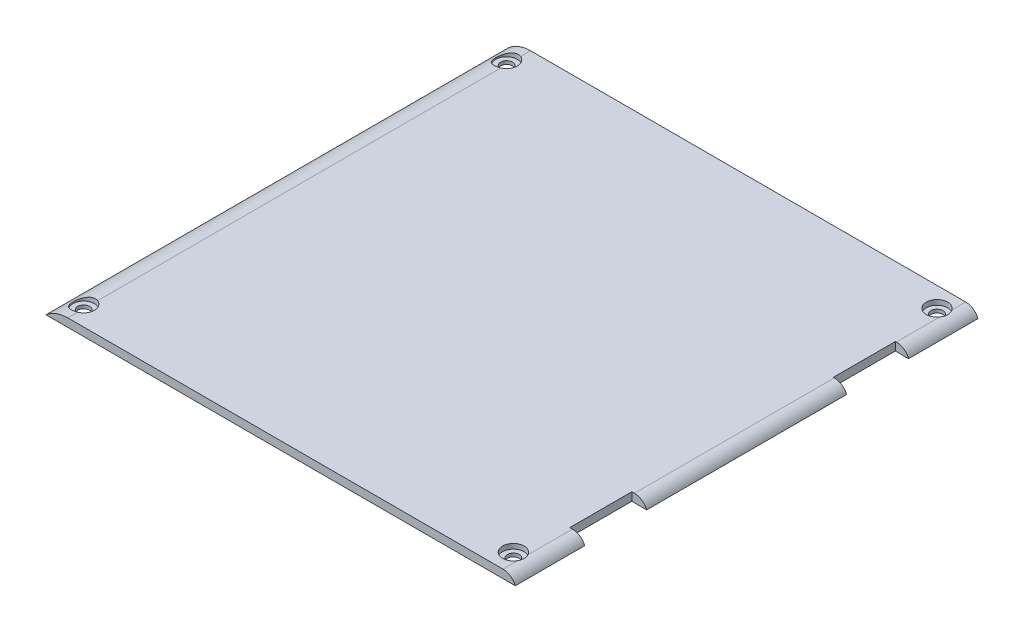
ISO-10303-21;
HEADER;
FILE_DESCRIPTION(('STEP AP214'),'2;1');
FILE_NAME('part.step','',(''),(''),'','','');
FILE_SCHEMA(('AUTOMOTIVE_DESIGN { 1 0 10303 214 1 1 1 1 }'));
ENDSEC;
DATA;
#1=APPLICATION_CONTEXT('core data for automotive mechanical design processes');
#2=APPLICATION_PROTOCOL_DEFINITION('international standard','automotive_design',2000,#1);
#3=PRODUCT_CONTEXT('',#1,'mechanical');
#4=PRODUCT('Part','Part','',(#3));
#5=PRODUCT_RELATED_PRODUCT_CATEGORY('part','',(#4));
#6=PRODUCT_DEFINITION_FORMATION('','',#4);
#7=PRODUCT_DEFINITION_CONTEXT('part definition',#1,'design');
#8=PRODUCT_DEFINITION('design','',#6,#7);
#9=PRODUCT_DEFINITION_SHAPE('','',#8);
#10=(LENGTH_UNIT() NAMED_UNIT(*) SI_UNIT(.MILLI.,.METRE.));
#11=(NAMED_UNIT(*) PLANE_ANGLE_UNIT() SI_UNIT($,.RADIAN.));
#12=(NAMED_UNIT(*) SI_UNIT($,.STERADIAN.) SOLID_ANGLE_UNIT());
#13=UNCERTAINTY_MEASURE_WITH_UNIT(LENGTH_MEASURE(1.E-05),#10,'distance_accuracy_value','');
#14=(GEOMETRIC_REPRESENTATION_CONTEXT(3) GLOBAL_UNCERTAINTY_ASSIGNED_CONTEXT((#13)) GLOBAL_UNIT_ASSIGNED_CONTEXT((#10,
#11,#12)) REPRESENTATION_CONTEXT('',''));
#15=CARTESIAN_POINT('',(0.,0.,0.));
#16=DIRECTION('',(0.,0.,1.));
#17=DIRECTION('',(1.,0.,0.));
#18=AXIS2_PLACEMENT_3D('',#15,#16,#17);
#19=CARTESIAN_POINT('',(-71.,-2.5,70.));
#20=DIRECTION('',(0.,0.,1.));
#21=DIRECTION('',(1.,0.,0.));
#22=AXIS2_PLACEMENT_3D('',#19,#20,#21);
#23=PLANE('',#22);
#24=DIRECTION('',(1.,0.,0.));
#25=VECTOR('',#24,1.);
#26=CARTESIAN_POINT('',(-71.,-2.5,70.));
#27=LINE('',#26,#25);
#28=CARTESIAN_POINT('',(-71.,-2.5,70.));
#29=VERTEX_POINT('',#28);
#30=CARTESIAN_POINT('',(71.,-2.5,70.));
#31=VERTEX_POINT('',#30);
#32=EDGE_CURVE('E240',#29,#31,#27,.T.);
#33=ORIENTED_EDGE('',*,*,#32,.T.);
#34=CARTESIAN_POINT('',(67.2919007564522,-4.,70.));
#35=DIRECTION('',(0.,0.,1.));
#36=DIRECTION('',(1.,0.,0.));
#37=AXIS2_PLACEMENT_3D('',#34,#35,#36);
#38=CIRCLE('',#37,4.);
#39=CARTESIAN_POINT('',(67.2919007564522,0.,70.));
#40=VERTEX_POINT('',#39);
#41=EDGE_CURVE('E338',#31,#40,#38,.T.);
#42=ORIENTED_EDGE('',*,*,#41,.T.);
#43=DIRECTION('',(1.,0.,0.));
#44=VECTOR('',#43,1.);
#45=CARTESIAN_POINT('',(-71.,0.,70.));
#46=LINE('',#45,#44);
#47=CARTESIAN_POINT('',(-64.3856217223385,0.,70.));
#48=VERTEX_POINT('',#47);
#49=EDGE_CURVE('E247',#48,#40,#46,.T.);
#50=ORIENTED_EDGE('',*,*,#49,.F.);
#51=CARTESIAN_POINT('',(-64.3856217223385,-10.,70.));
#52=DIRECTION('',(0.,0.,1.));
#53=DIRECTION('',(1.,0.,0.));
#54=AXIS2_PLACEMENT_3D('',#51,#52,#53);
#55=CIRCLE('',#54,10.);
#56=EDGE_CURVE('E614',#48,#29,#55,.T.);
#57=ORIENTED_EDGE('',*,*,#56,.T.);
#58=EDGE_LOOP('',(#33,#42,#50,#57));
#59=FACE_BOUND('',#58,.T.);
#60=ADVANCED_FACE('F36',(#59),#23,.T.);
#61=CARTESIAN_POINT('',(-71.,-2.5,-70.));
#62=DIRECTION('',(0.,0.,-1.));
#63=DIRECTION('',(-1.,0.,0.));
#64=AXIS2_PLACEMENT_3D('',#61,#62,#63);
#65=PLANE('',#64);
#66=DIRECTION('',(-1.,0.,0.));
#67=VECTOR('',#66,1.);
#68=CARTESIAN_POINT('',(-71.,0.,-70.));
#69=LINE('',#68,#67);
#70=CARTESIAN_POINT('',(67.2919007564522,0.,-70.));
#71=VERTEX_POINT('',#70);
#72=CARTESIAN_POINT('',(-64.3856217223385,0.,-70.));
#73=VERTEX_POINT('',#72);
#74=EDGE_CURVE('E223',#71,#73,#69,.T.);
#75=ORIENTED_EDGE('',*,*,#74,.F.);
#76=CARTESIAN_POINT('',(67.2919007564522,-4.,-70.));
#77=DIRECTION('',(0.,0.,-1.));
#78=DIRECTION('',(-1.,0.,0.));
#79=AXIS2_PLACEMENT_3D('',#76,#77,#78);
#80=CIRCLE('',#79,4.);
#81=CARTESIAN_POINT('',(71.,-2.5,-70.));
#82=VERTEX_POINT('',#81);
#83=EDGE_CURVE('E46',#71,#82,#80,.T.);
#84=ORIENTED_EDGE('',*,*,#83,.T.);
#85=DIRECTION('',(-1.,0.,0.));
#86=VECTOR('',#85,1.);
#87=CARTESIAN_POINT('',(-71.,-2.5,-70.));
#88=LINE('',#87,#86);
#89=CARTESIAN_POINT('',(-71.,-2.5,-70.));
#90=VERTEX_POINT('',#89);
#91=EDGE_CURVE('E231',#82,#90,#88,.T.);
#92=ORIENTED_EDGE('',*,*,#91,.T.);
#93=CARTESIAN_POINT('',(-64.3856217223385,-10.,-70.));
#94=DIRECTION('',(0.,0.,-1.));
#95=DIRECTION('',(-1.,0.,0.));
#96=AXIS2_PLACEMENT_3D('',#93,#94,#95);
#97=CIRCLE('',#96,10.);
#98=EDGE_CURVE('E616',#90,#73,#97,.T.);
#99=ORIENTED_EDGE('',*,*,#98,.T.);
#100=EDGE_LOOP('',(#75,#84,#92,#99));
#101=FACE_BOUND('',#100,.T.);
#102=ADVANCED_FACE('F317',(#101),#65,.T.);
#103=CARTESIAN_POINT('',(0.,-2.5,0.));
#104=DIRECTION('',(0.,1.,0.));
#105=DIRECTION('',(0.,0.,1.));
#106=AXIS2_PLACEMENT_3D('',#103,#104,#105);
#107=PLANE('',#106);
#108=CARTESIAN_POINT('',(-65.6357603,-2.5,-64.));
#109=DIRECTION('',(0.,1.,0.));
#110=DIRECTION('',(0.,0.,1.));
#111=AXIS2_PLACEMENT_3D('',#108,#109,#110);
#112=CIRCLE('',#111,1.8);
#113=CARTESIAN_POINT('',(-65.6357603,-2.5,-62.2));
#114=VERTEX_POINT('',#113);
#115=EDGE_CURVE('E637',#114,#114,#112,.T.);
#116=ORIENTED_EDGE('',*,*,#115,.T.);
#117=EDGE_LOOP('',(#116));
#118=FACE_BOUND('',#117,.T.);
#119=CARTESIAN_POINT('',(64.59576602,-2.5,-64.));
#120=DIRECTION('',(0.,1.,0.));
#121=DIRECTION('',(0.,0.,1.));
#122=AXIS2_PLACEMENT_3D('',#119,#120,#121);
#123=CIRCLE('',#122,1.8);
#124=CARTESIAN_POINT('',(64.59576602,-2.5,-62.2));
#125=VERTEX_POINT('',#124);
#126=EDGE_CURVE('E656',#125,#125,#123,.T.);
#127=ORIENTED_EDGE('',*,*,#126,.T.);
#128=EDGE_LOOP('',(#127));
#129=FACE_BOUND('',#128,.T.);
#130=CARTESIAN_POINT('',(64.41475083,-2.5,64.));
#131=DIRECTION('',(0.,1.,0.));
#132=DIRECTION('',(0.,0.,1.));
#133=AXIS2_PLACEMENT_3D('',#130,#131,#132);
#134=CIRCLE('',#133,1.8);
#135=CARTESIAN_POINT('',(64.41475083,-2.5,65.8));
#136=VERTEX_POINT('',#135);
#137=EDGE_CURVE('E669',#136,#136,#134,.T.);
#138=ORIENTED_EDGE('',*,*,#137,.T.);
#139=EDGE_LOOP('',(#138));
#140=FACE_BOUND('',#139,.T.);
#141=CARTESIAN_POINT('',(-65.595766,-2.5,64.));
#142=DIRECTION('',(0.,1.,0.));
#143=DIRECTION('',(0.,0.,1.));
#144=AXIS2_PLACEMENT_3D('',#141,#142,#143);
#145=CIRCLE('',#144,1.8);
#146=CARTESIAN_POINT('',(-65.595766,-2.5,65.8));
#147=VERTEX_POINT('',#146);
#148=EDGE_CURVE('E186',#147,#147,#145,.T.);
#149=ORIENTED_EDGE('',*,*,#148,.T.);
#150=EDGE_LOOP('',(#149));
#151=FACE_BOUND('',#150,.T.);
#152=DIRECTION('',(0.,0.,-1.));
#153=VECTOR('',#152,1.);
#154=CARTESIAN_POINT('',(71.,-2.5,-70.));
#155=LINE('',#154,#153);
#156=CARTESIAN_POINT('',(71.,-2.5,30.25));
#157=VERTEX_POINT('',#156);
#158=CARTESIAN_POINT('',(71.,-2.5,-30.25));
#159=VERTEX_POINT('',#158);
#160=EDGE_CURVE('E176',#157,#159,#155,.T.);
#161=ORIENTED_EDGE('',*,*,#160,.F.);
#162=DIRECTION('',(-1.,0.,0.));
#163=VECTOR('',#162,1.);
#164=CARTESIAN_POINT('',(71.,-2.5,30.25));
#165=LINE('',#164,#163);
#166=CARTESIAN_POINT('',(66.5,-2.5,30.25));
#167=VERTEX_POINT('',#166);
#168=EDGE_CURVE('E153',#157,#167,#165,.T.);
#169=ORIENTED_EDGE('',*,*,#168,.T.);
#170=DIRECTION('',(0.,0.,1.));
#171=VECTOR('',#170,1.);
#172=CARTESIAN_POINT('',(66.5,-2.5,30.25));
#173=LINE('',#172,#171);
#174=CARTESIAN_POINT('',(66.5,-2.5,49.));
#175=VERTEX_POINT('',#174);
#176=EDGE_CURVE('E166',#167,#175,#173,.T.);
#177=ORIENTED_EDGE('',*,*,#176,.T.);
#178=DIRECTION('',(-1.,0.,0.));
#179=VECTOR('',#178,1.);
#180=CARTESIAN_POINT('',(71.,-2.5,49.));
#181=LINE('',#180,#179);
#182=CARTESIAN_POINT('',(71.,-2.5,49.));
#183=VERTEX_POINT('',#182);
#184=EDGE_CURVE('E162',#183,#175,#181,.T.);
#185=ORIENTED_EDGE('',*,*,#184,.F.);
#186=EDGE_CURVE('E227',#31,#183,#155,.T.);
#187=ORIENTED_EDGE('',*,*,#186,.F.);
#188=ORIENTED_EDGE('',*,*,#32,.F.);
#189=DIRECTION('',(0.,0.,1.));
#190=VECTOR('',#189,1.);
#191=CARTESIAN_POINT('',(-71.,-2.5,-70.));
#192=LINE('',#191,#190);
#193=EDGE_CURVE('E236',#90,#29,#192,.T.);
#194=ORIENTED_EDGE('',*,*,#193,.F.);
#195=ORIENTED_EDGE('',*,*,#91,.F.);
#196=CARTESIAN_POINT('',(71.,-2.5,-49.));
#197=VERTEX_POINT('',#196);
#198=EDGE_CURVE('E232',#197,#82,#155,.T.);
#199=ORIENTED_EDGE('',*,*,#198,.F.);
#200=DIRECTION('',(-1.,0.,0.));
#201=VECTOR('',#200,1.);
#202=CARTESIAN_POINT('',(67.,-2.5,-49.));
#203=LINE('',#202,#201);
#204=CARTESIAN_POINT('',(67.,-2.5,-49.));
#205=VERTEX_POINT('',#204);
#206=EDGE_CURVE('E206',#197,#205,#203,.T.);
#207=ORIENTED_EDGE('',*,*,#206,.T.);
#208=DIRECTION('',(0.,0.,1.));
#209=VECTOR('',#208,1.);
#210=CARTESIAN_POINT('',(67.,-2.5,-49.));
#211=LINE('',#210,#209);
#212=CARTESIAN_POINT('',(67.,-2.5,-30.25));
#213=VERTEX_POINT('',#212);
#214=EDGE_CURVE('E198',#205,#213,#211,.T.);
#215=ORIENTED_EDGE('',*,*,#214,.T.);
#216=DIRECTION('',(1.,0.,0.));
#217=VECTOR('',#216,1.);
#218=CARTESIAN_POINT('',(67.,-2.5,-30.25));
#219=LINE('',#218,#217);
#220=EDGE_CURVE('E202',#213,#159,#219,.T.);
#221=ORIENTED_EDGE('',*,*,#220,.T.);
#222=EDGE_LOOP('',(#161,#169,#177,#185,#187,#188,#194,#195,#199,#207,#215,#221));
#223=FACE_BOUND('',#222,.T.);
#224=ADVANCED_FACE('F173',(#118,#129,#140,#151,#223),#107,.F.);
#225=CARTESIAN_POINT('',(0.,0.,0.));
#226=DIRECTION('',(0.,1.,0.));
#227=DIRECTION('',(0.,0.,1.));
#228=AXIS2_PLACEMENT_3D('',#225,#226,#227);
#229=PLANE('',#228);
#230=ORIENTED_EDGE('',*,*,#49,.T.);
#231=DIRECTION('',(0.,0.,-1.));
#232=VECTOR('',#231,1.);
#233=CARTESIAN_POINT('',(67.2919007564522,0.,49.));
#234=LINE('',#233,#232);
#235=CARTESIAN_POINT('',(67.2919007564522,0.,65.5114589973652));
#236=VERTEX_POINT('',#235);
#237=EDGE_CURVE('E354',#40,#236,#234,.T.);
#238=ORIENTED_EDGE('',*,*,#237,.T.);
#239=CARTESIAN_POINT('',(64.41475083,0.,64.));
#240=DIRECTION('',(0.,1.,0.));
#241=DIRECTION('',(0.,0.,1.));
#242=AXIS2_PLACEMENT_3D('',#239,#240,#241);
#243=CIRCLE('',#242,3.25);
#244=CARTESIAN_POINT('',(67.2919007564522,0.,62.4885410026348));
#245=VERTEX_POINT('',#244);
#246=EDGE_CURVE('E660',#245,#236,#243,.T.);
#247=ORIENTED_EDGE('',*,*,#246,.F.);
#248=DIRECTION('',(0.,0.,-1.));
#249=VECTOR('',#248,1.);
#250=CARTESIAN_POINT('',(67.2919007564522,0.,49.));
#251=LINE('',#250,#249);
#252=CARTESIAN_POINT('',(67.2919007564522,0.,49.));
#253=VERTEX_POINT('',#252);
#254=EDGE_CURVE('E629',#245,#253,#251,.T.);
#255=ORIENTED_EDGE('',*,*,#254,.T.);
#256=DIRECTION('',(-1.,0.,0.));
#257=VECTOR('',#256,1.);
#258=CARTESIAN_POINT('',(71.,0.,49.));
#259=LINE('',#258,#257);
#260=CARTESIAN_POINT('',(66.5,0.,49.));
#261=VERTEX_POINT('',#260);
#262=EDGE_CURVE('E179',#253,#261,#259,.T.);
#263=ORIENTED_EDGE('',*,*,#262,.T.);
#264=DIRECTION('',(0.,0.,1.));
#265=VECTOR('',#264,1.);
#266=CARTESIAN_POINT('',(66.5,0.,30.25));
#267=LINE('',#266,#265);
#268=CARTESIAN_POINT('',(66.5,0.,30.25));
#269=VERTEX_POINT('',#268);
#270=EDGE_CURVE('E183',#269,#261,#267,.T.);
#271=ORIENTED_EDGE('',*,*,#270,.F.);
#272=DIRECTION('',(-1.,0.,0.));
#273=VECTOR('',#272,1.);
#274=CARTESIAN_POINT('',(71.,0.,30.25));
#275=LINE('',#274,#273);
#276=CARTESIAN_POINT('',(67.2919007564522,0.,30.25));
#277=VERTEX_POINT('',#276);
#278=EDGE_CURVE('E156',#277,#269,#275,.T.);
#279=ORIENTED_EDGE('',*,*,#278,.F.);
#280=DIRECTION('',(0.,0.,-1.));
#281=VECTOR('',#280,1.);
#282=CARTESIAN_POINT('',(67.2919007564522,0.,-30.25));
#283=LINE('',#282,#281);
#284=CARTESIAN_POINT('',(67.2919007564522,0.,-30.25));
#285=VERTEX_POINT('',#284);
#286=EDGE_CURVE('E335',#277,#285,#283,.T.);
#287=ORIENTED_EDGE('',*,*,#286,.T.);
#288=DIRECTION('',(1.,0.,0.));
#289=VECTOR('',#288,1.);
#290=CARTESIAN_POINT('',(67.,0.,-30.25));
#291=LINE('',#290,#289);
#292=CARTESIAN_POINT('',(67.,0.,-30.25));
#293=VERTEX_POINT('',#292);
#294=EDGE_CURVE('E213',#293,#285,#291,.T.);
#295=ORIENTED_EDGE('',*,*,#294,.F.);
#296=DIRECTION('',(0.,0.,1.));
#297=VECTOR('',#296,1.);
#298=CARTESIAN_POINT('',(67.,0.,-49.));
#299=LINE('',#298,#297);
#300=CARTESIAN_POINT('',(67.,0.,-49.));
#301=VERTEX_POINT('',#300);
#302=EDGE_CURVE('E196',#301,#293,#299,.T.);
#303=ORIENTED_EDGE('',*,*,#302,.F.);
#304=DIRECTION('',(-1.,0.,0.));
#305=VECTOR('',#304,1.);
#306=CARTESIAN_POINT('',(67.,0.,-49.));
#307=LINE('',#306,#305);
#308=CARTESIAN_POINT('',(67.2919007564522,0.,-49.));
#309=VERTEX_POINT('',#308);
#310=EDGE_CURVE('E203',#309,#301,#307,.T.);
#311=ORIENTED_EDGE('',*,*,#310,.F.);
#312=DIRECTION('',(0.,0.,-1.));
#313=VECTOR('',#312,1.);
#314=CARTESIAN_POINT('',(67.2919007564522,0.,-70.));
#315=LINE('',#314,#313);
#316=CARTESIAN_POINT('',(67.2919007564522,0.,-62.1852390011641));
#317=VERTEX_POINT('',#316);
#318=EDGE_CURVE('E624',#309,#317,#315,.T.);
#319=ORIENTED_EDGE('',*,*,#318,.T.);
#320=CARTESIAN_POINT('',(64.59576602,0.,-64.));
#321=DIRECTION('',(0.,1.,0.));
#322=DIRECTION('',(0.,0.,1.));
#323=AXIS2_PLACEMENT_3D('',#320,#321,#322);
#324=CIRCLE('',#323,3.25);
#325=CARTESIAN_POINT('',(67.2919007564522,0.,-65.8147609988359));
#326=VERTEX_POINT('',#325);
#327=EDGE_CURVE('E635',#326,#317,#324,.T.);
#328=ORIENTED_EDGE('',*,*,#327,.F.);
#329=DIRECTION('',(0.,0.,-1.));
#330=VECTOR('',#329,1.);
#331=CARTESIAN_POINT('',(67.2919007564522,0.,-70.));
#332=LINE('',#331,#330);
#333=EDGE_CURVE('E618',#326,#71,#332,.T.);
#334=ORIENTED_EDGE('',*,*,#333,.T.);
#335=ORIENTED_EDGE('',*,*,#74,.T.);
#336=DIRECTION('',(0.,0.,1.));
#337=VECTOR('',#336,1.);
#338=CARTESIAN_POINT('',(-64.3856217223385,0.,70.));
#339=LINE('',#338,#337);
#340=CARTESIAN_POINT('',(-64.3856217223385,0.,-66.9999422555513));
#341=VERTEX_POINT('',#340);
#342=EDGE_CURVE('E256',#73,#341,#339,.T.);
#343=ORIENTED_EDGE('',*,*,#342,.T.);
#344=CARTESIAN_POINT('',(-65.6357603,0.,-64.));
#345=DIRECTION('',(0.,1.,0.));
#346=DIRECTION('',(0.,0.,1.));
#347=AXIS2_PLACEMENT_3D('',#344,#345,#346);
#348=CIRCLE('',#347,3.25);
#349=CARTESIAN_POINT('',(-64.3856217223385,0.,-61.0000577444487));
#350=VERTEX_POINT('',#349);
#351=EDGE_CURVE('E691',#350,#341,#348,.T.);
#352=ORIENTED_EDGE('',*,*,#351,.F.);
#353=DIRECTION('',(0.,0.,1.));
#354=VECTOR('',#353,1.);
#355=CARTESIAN_POINT('',(-64.3856217223385,0.,70.));
#356=LINE('',#355,#354);
#357=CARTESIAN_POINT('',(-64.3856217223385,0.,60.9837024637408));
#358=VERTEX_POINT('',#357);
#359=EDGE_CURVE('E253',#350,#358,#356,.T.);
#360=ORIENTED_EDGE('',*,*,#359,.T.);
#361=CARTESIAN_POINT('',(-65.595766,0.,64.));
#362=DIRECTION('',(0.,1.,0.));
#363=DIRECTION('',(0.,0.,1.));
#364=AXIS2_PLACEMENT_3D('',#361,#362,#363);
#365=CIRCLE('',#364,3.25);
#366=CARTESIAN_POINT('',(-64.3856217223385,0.,67.0162975362592));
#367=VERTEX_POINT('',#366);
#368=EDGE_CURVE('E611',#367,#358,#365,.T.);
#369=ORIENTED_EDGE('',*,*,#368,.F.);
#370=DIRECTION('',(0.,0.,1.));
#371=VECTOR('',#370,1.);
#372=CARTESIAN_POINT('',(-64.3856217223385,0.,70.));
#373=LINE('',#372,#371);
#374=EDGE_CURVE('E244',#367,#48,#373,.T.);
#375=ORIENTED_EDGE('',*,*,#374,.T.);
#376=EDGE_LOOP('',(#230,#238,#247,#255,#263,#271,#279,#287,#295,#303,#311,#319,#328,#334,#335,
#343,#352,#360,#369,#375));
#377=FACE_BOUND('',#376,.T.);
#378=ADVANCED_FACE('F402',(#377),#229,.T.);
#379=CARTESIAN_POINT('',(67.,-2.5,-49.));
#380=DIRECTION('',(-1.,0.,0.));
#381=DIRECTION('',(0.,0.,1.));
#382=AXIS2_PLACEMENT_3D('',#379,#380,#381);
#383=PLANE('',#382);
#384=ORIENTED_EDGE('',*,*,#302,.T.);
#385=DIRECTION('',(0.,1.,0.));
#386=VECTOR('',#385,1.);
#387=CARTESIAN_POINT('',(67.,-2.5,-30.25));
#388=LINE('',#387,#386);
#389=EDGE_CURVE('E210',#213,#293,#388,.T.);
#390=ORIENTED_EDGE('',*,*,#389,.F.);
#391=ORIENTED_EDGE('',*,*,#214,.F.);
#392=DIRECTION('',(0.,1.,0.));
#393=VECTOR('',#392,1.);
#394=CARTESIAN_POINT('',(67.,-2.5,-49.));
#395=LINE('',#394,#393);
#396=EDGE_CURVE('E219',#205,#301,#395,.T.);
#397=ORIENTED_EDGE('',*,*,#396,.T.);
#398=EDGE_LOOP('',(#384,#390,#391,#397));
#399=FACE_BOUND('',#398,.T.);
#400=ADVANCED_FACE('F396',(#399),#383,.F.);
#401=CARTESIAN_POINT('',(67.,-2.5,-49.));
#402=DIRECTION('',(0.,0.,-1.));
#403=DIRECTION('',(-1.,0.,0.));
#404=AXIS2_PLACEMENT_3D('',#401,#402,#403);
#405=PLANE('',#404);
#406=ORIENTED_EDGE('',*,*,#206,.F.);
#407=CARTESIAN_POINT('',(67.2919007564522,-4.,-49.));
#408=DIRECTION('',(0.,0.,-1.));
#409=DIRECTION('',(-1.,0.,0.));
#410=AXIS2_PLACEMENT_3D('',#407,#408,#409);
#411=CIRCLE('',#410,4.);
#412=EDGE_CURVE('E11',#197,#309,#411,.F.);
#413=ORIENTED_EDGE('',*,*,#412,.T.);
#414=ORIENTED_EDGE('',*,*,#310,.T.);
#415=ORIENTED_EDGE('',*,*,#396,.F.);
#416=EDGE_LOOP('',(#406,#413,#414,#415));
#417=FACE_BOUND('',#416,.T.);
#418=ADVANCED_FACE('F393',(#417),#405,.F.);
#419=CARTESIAN_POINT('',(67.,-2.5,-30.25));
#420=DIRECTION('',(0.,0.,1.));
#421=DIRECTION('',(1.,0.,0.));
#422=AXIS2_PLACEMENT_3D('',#419,#420,#421);
#423=PLANE('',#422);
#424=ORIENTED_EDGE('',*,*,#294,.T.);
#425=CARTESIAN_POINT('',(67.2919007564522,-4.,-30.25));
#426=DIRECTION('',(0.,0.,1.));
#427=DIRECTION('',(1.,0.,0.));
#428=AXIS2_PLACEMENT_3D('',#425,#426,#427);
#429=CIRCLE('',#428,4.);
#430=EDGE_CURVE('E333',#285,#159,#429,.F.);
#431=ORIENTED_EDGE('',*,*,#430,.T.);
#432=ORIENTED_EDGE('',*,*,#220,.F.);
#433=ORIENTED_EDGE('',*,*,#389,.T.);
#434=EDGE_LOOP('',(#424,#431,#432,#433));
#435=FACE_BOUND('',#434,.T.);
#436=ADVANCED_FACE('F392',(#435),#423,.F.);
#437=CARTESIAN_POINT('',(71.,-2.5,30.25));
#438=DIRECTION('',(0.,0.,-1.));
#439=DIRECTION('',(-1.,0.,0.));
#440=AXIS2_PLACEMENT_3D('',#437,#438,#439);
#441=PLANE('',#440);
#442=ORIENTED_EDGE('',*,*,#168,.F.);
#443=CARTESIAN_POINT('',(67.2919007564522,-4.,30.25));
#444=DIRECTION('',(0.,0.,-1.));
#445=DIRECTION('',(-1.,0.,0.));
#446=AXIS2_PLACEMENT_3D('',#443,#444,#445);
#447=CIRCLE('',#446,4.);
#448=EDGE_CURVE('E308',#157,#277,#447,.F.);
#449=ORIENTED_EDGE('',*,*,#448,.T.);
#450=ORIENTED_EDGE('',*,*,#278,.T.);
#451=DIRECTION('',(0.,1.,0.));
#452=VECTOR('',#451,1.);
#453=CARTESIAN_POINT('',(66.5,-2.5,30.25));
#454=LINE('',#453,#452);
#455=EDGE_CURVE('E149',#167,#269,#454,.T.);
#456=ORIENTED_EDGE('',*,*,#455,.F.);
#457=EDGE_LOOP('',(#442,#449,#450,#456));
#458=FACE_BOUND('',#457,.T.);
#459=ADVANCED_FACE('F151',(#458),#441,.F.);
#460=CARTESIAN_POINT('',(71.,-2.5,49.));
#461=DIRECTION('',(0.,0.,-1.));
#462=DIRECTION('',(-1.,0.,0.));
#463=AXIS2_PLACEMENT_3D('',#460,#461,#462);
#464=PLANE('',#463);
#465=ORIENTED_EDGE('',*,*,#262,.F.);
#466=CARTESIAN_POINT('',(67.2919007564522,-4.,49.));
#467=DIRECTION('',(0.,0.,-1.));
#468=DIRECTION('',(-1.,0.,0.));
#469=AXIS2_PLACEMENT_3D('',#466,#467,#468);
#470=CIRCLE('',#469,4.);
#471=EDGE_CURVE('E343',#253,#183,#470,.T.);
#472=ORIENTED_EDGE('',*,*,#471,.T.);
#473=ORIENTED_EDGE('',*,*,#184,.T.);
#474=DIRECTION('',(0.,1.,0.));
#475=VECTOR('',#474,1.);
#476=CARTESIAN_POINT('',(66.5,-2.5,49.));
#477=LINE('',#476,#475);
#478=EDGE_CURVE('E161',#175,#261,#477,.T.);
#479=ORIENTED_EDGE('',*,*,#478,.T.);
#480=EDGE_LOOP('',(#465,#472,#473,#479));
#481=FACE_BOUND('',#480,.T.);
#482=ADVANCED_FACE('F384',(#481),#464,.T.);
#483=CARTESIAN_POINT('',(66.5,-2.5,30.25));
#484=DIRECTION('',(-1.,0.,0.));
#485=DIRECTION('',(0.,0.,1.));
#486=AXIS2_PLACEMENT_3D('',#483,#484,#485);
#487=PLANE('',#486);
#488=ORIENTED_EDGE('',*,*,#270,.T.);
#489=ORIENTED_EDGE('',*,*,#478,.F.);
#490=ORIENTED_EDGE('',*,*,#176,.F.);
#491=ORIENTED_EDGE('',*,*,#455,.T.);
#492=EDGE_LOOP('',(#488,#489,#490,#491));
#493=FACE_BOUND('',#492,.T.);
#494=ADVANCED_FACE('F167',(#493),#487,.F.);
#495=CARTESIAN_POINT('',(-65.595766,0.,64.));
#496=DIRECTION('',(0.,1.,0.));
#497=DIRECTION('',(0.,0.,1.));
#498=AXIS2_PLACEMENT_3D('',#495,#496,#497);
#499=CYLINDRICAL_SURFACE('',#498,1.8);
#500=ORIENTED_EDGE('',*,*,#148,.F.);
#501=EDGE_LOOP('',(#500));
#502=FACE_BOUND('',#501,.T.);
#503=CARTESIAN_POINT('',(-65.595766,-1.5,64.));
#504=DIRECTION('',(0.,1.,0.));
#505=DIRECTION('',(0.,0.,1.));
#506=AXIS2_PLACEMENT_3D('',#503,#504,#505);
#507=CIRCLE('',#506,1.8);
#508=CARTESIAN_POINT('',(-65.595766,-1.5,65.8));
#509=VERTEX_POINT('',#508);
#510=EDGE_CURVE('E677',#509,#509,#507,.T.);
#511=ORIENTED_EDGE('',*,*,#510,.T.);
#512=EDGE_LOOP('',(#511));
#513=FACE_BOUND('',#512,.T.);
#514=ADVANCED_FACE('F379',(#502,#513),#499,.F.);
#515=CARTESIAN_POINT('',(-63.795766,-1.5,64.));
#516=DIRECTION('',(0.,-1.,0.));
#517=DIRECTION('',(0.,0.,-1.));
#518=AXIS2_PLACEMENT_3D('',#515,#516,#517);
#519=PLANE('',#518);
#520=ORIENTED_EDGE('',*,*,#510,.F.);
#521=EDGE_LOOP('',(#520));
#522=FACE_BOUND('',#521,.T.);
#523=CARTESIAN_POINT('',(-65.595766,-1.5,64.));
#524=DIRECTION('',(0.,1.,0.));
#525=DIRECTION('',(0.,0.,1.));
#526=AXIS2_PLACEMENT_3D('',#523,#524,#525);
#527=CIRCLE('',#526,3.25);
#528=CARTESIAN_POINT('',(-65.595766,-1.5,67.25));
#529=VERTEX_POINT('',#528);
#530=EDGE_CURVE('E674',#529,#529,#527,.T.);
#531=ORIENTED_EDGE('',*,*,#530,.T.);
#532=EDGE_LOOP('',(#531));
#533=FACE_BOUND('',#532,.T.);
#534=ADVANCED_FACE('F375',(#522,#533),#519,.F.);
#535=CARTESIAN_POINT('',(-65.595766,0.,64.));
#536=DIRECTION('',(0.,1.,0.));
#537=DIRECTION('',(0.,0.,1.));
#538=AXIS2_PLACEMENT_3D('',#535,#536,#537);
#539=CYLINDRICAL_SURFACE('',#538,3.25);
#540=ORIENTED_EDGE('',*,*,#530,.F.);
#541=EDGE_LOOP('',(#540));
#542=FACE_BOUND('',#541,.T.);
#543=ORIENTED_EDGE('',*,*,#368,.T.);
#544=CARTESIAN_POINT('',(-64.3856217223385,0.,60.9837024637408));
#545=CARTESIAN_POINT('',(-64.4672396390824,9.14656208953422E-06,60.9509455444336));
#546=CARTESIAN_POINT('',(-64.5501938706694,-0.000998986642267825,60.9215220213259));
#547=CARTESIAN_POINT('',(-64.7181580193757,-0.00517988779813323,60.8695023573232));
#548=CARTESIAN_POINT('',(-64.8031678312296,-0.00835254513075945,60.846905867615));
#549=CARTESIAN_POINT('',(-64.9744534376785,-0.0169834104964006,60.8087378627611));
#550=CARTESIAN_POINT('',(-65.0607261763612,-0.0224367730979332,60.7931515990124));
#551=CARTESIAN_POINT('',(-65.2340462378848,-0.0356761678019687,60.7690054202401));
#552=CARTESIAN_POINT('',(-65.3210935399334,-0.0434621374705436,60.7604453171793));
#553=CARTESIAN_POINT('',(-65.5825353395095,-0.070350445978573,60.7453532142202));
#554=CARTESIAN_POINT('',(-65.7573066085942,-0.0929869529666919,60.7493924423628));
#555=CARTESIAN_POINT('',(-66.1025197480181,-0.146935728699643,60.7850540091254));
#556=CARTESIAN_POINT('',(-66.2729611616193,-0.178248908595464,60.8166792453449));
#557=CARTESIAN_POINT('',(-66.6080522273404,-0.248560284432392,60.906724530392));
#558=CARTESIAN_POINT('',(-66.7725614023731,-0.287675887952041,60.9655747164191));
#559=CARTESIAN_POINT('',(-67.0890570827036,-0.370967334494837,61.1081584828456));
#560=CARTESIAN_POINT('',(-67.241037783921,-0.415145500456458,61.1919035144758));
#561=CARTESIAN_POINT('',(-67.5381836858545,-0.508579033151061,61.3878939233738));
#562=CARTESIAN_POINT('',(-67.6823595311235,-0.557979618177449,61.5015720198568));
#563=CARTESIAN_POINT('',(-67.949823855745,-0.65565556217056,61.7517854538328));
#564=CARTESIAN_POINT('',(-68.0731053040843,-0.703930537672913,61.8883284548138));
#565=CARTESIAN_POINT('',(-68.2989775705101,-0.796684215055598,62.1858693440039));
#566=CARTESIAN_POINT('',(-68.4008262980554,-0.841003096148653,62.3474839936927));
#567=CARTESIAN_POINT('',(-68.5753292931595,-0.919495359038401,62.688037979355));
#568=CARTESIAN_POINT('',(-68.6480006740702,-0.953674684894331,62.8669670832445));
#569=CARTESIAN_POINT('',(-68.7572116228924,-1.00596519340184,63.2250678001043));
#570=CARTESIAN_POINT('',(-68.7957650014469,-1.02496431881509,63.4034918296834));
#571=CARTESIAN_POINT('',(-68.8423860102871,-1.04801835733612,63.7651818824627));
#572=CARTESIAN_POINT('',(-68.8504754481947,-1.05208396055933,63.9484443473938));
#573=CARTESIAN_POINT('',(-68.8364458402678,-1.04510344835285,64.2968730979556));
#574=CARTESIAN_POINT('',(-68.8169835534689,-1.03538621664355,64.4621817879428));
#575=CARTESIAN_POINT('',(-68.7534171263691,-1.00424541444159,64.7868315691518));
#576=CARTESIAN_POINT('',(-68.7093099548827,-0.982820403963615,64.9461719237283));
#577=CARTESIAN_POINT('',(-68.5977845086396,-0.930188495208362,65.2560763757671));
#578=CARTESIAN_POINT('',(-68.530192971608,-0.898909057822555,65.4065652394631));
#579=CARTESIAN_POINT('',(-68.3739569405773,-0.829368735949721,65.6944018039429));
#580=CARTESIAN_POINT('',(-68.2853057098595,-0.79110561838464,65.8317452799268));
#581=CARTESIAN_POINT('',(-68.0801797954006,-0.706797833194026,66.102771921094));
#582=CARTESIAN_POINT('',(-67.9619008204515,-0.660361458183978,66.2349686656434));
#583=CARTESIAN_POINT('',(-67.7057054849812,-0.566248350077713,66.4782848641897));
#584=CARTESIAN_POINT('',(-67.5677789708916,-0.518570986133255,66.5893933503944));
#585=CARTESIAN_POINT('',(-67.2655240060267,-0.422270295880017,66.7946235060229));
#586=CARTESIAN_POINT('',(-67.1000541662812,-0.373792002936363,66.8871413341397));
#587=CARTESIAN_POINT('',(-66.7541727682123,-0.282907377090554,67.042450194857));
#588=CARTESIAN_POINT('',(-66.5737659539014,-0.240499127918471,67.1052506235321));
#589=CARTESIAN_POINT('',(-66.2073554379566,-0.165601310677026,67.1973858841853));
#590=CARTESIAN_POINT('',(-66.0215886860048,-0.13289883585098,67.2274849584982));
#591=CARTESIAN_POINT('',(-65.646143425999,-0.0779537981551393,67.2550479955868));
#592=CARTESIAN_POINT('',(-65.4564670295334,-0.0557057358011528,67.2525291368013));
#593=CARTESIAN_POINT('',(-65.1172200675095,-0.0256450090930849,67.2181500200859));
#594=CARTESIAN_POINT('',(-64.9672060891838,-0.0158366310989504,67.192250891795));
#595=CARTESIAN_POINT('',(-64.7458669333958,-0.00621666618960293,67.1378276828735));
#596=CARTESIAN_POINT('',(-64.672667773563,-0.00385886780750455,67.1170776253088));
#597=CARTESIAN_POINT('',(-64.5278603206275,-0.000748795603334098,67.0704827539929));
#598=CARTESIAN_POINT('',(-64.4562523024848,3.20282830602017E-06,67.0446370671849));
#599=CARTESIAN_POINT('',(-64.3856217223385,0.,67.0162975362592));
#600=B_SPLINE_CURVE_WITH_KNOTS('',3,(#544,#545,#546,#547,#548,#549,#550,#551,#552,#553,#554,
#555,#556,#557,#558,#559,#560,#561,#562,#563,#564,#565,#566,#567,#568,#569,#570,#571,#572,#573,
#574,#575,#576,#577,#578,#579,#580,#581,#582,#583,#584,#585,#586,#587,#588,#589,#590,#591,#592,
#593,#594,#595,#596,#597,#598,#599),.UNSPECIFIED.,.F.,.F.,(4,2,2,2,2,2,2,2,2,2,2,2,2,2,2,2,2,2,
2,2,2,2,2,2,2,2,2,4),(0.,0.263756431239656,0.527499384109731,0.790684830414579,1.05386323299842,
1.57998659387368,2.1061652247374,2.64095701065658,3.17599517389607,3.74384103394983,
4.31187759770644,4.8971656147736,5.48210984034644,6.02963863773872,6.57677541187451,
7.07460289204688,7.57249161574635,8.07413451099331,8.57593809179664,9.12368506903724,
9.67171614802217,10.255895162684,10.8398893474683,11.4099205730053,11.9796516002403,
12.4355848146686,12.6637630641475,12.8919804424491),.UNSPECIFIED.);
#601=EDGE_CURVE('E269',#358,#367,#600,.T.);
#602=ORIENTED_EDGE('',*,*,#601,.T.);
#603=EDGE_LOOP('',(#543,#602));
#604=FACE_BOUND('',#603,.T.);
#605=ADVANCED_FACE('F370',(#542,#604),#539,.F.);
#606=CARTESIAN_POINT('',(64.41475083,0.,64.));
#607=DIRECTION('',(0.,1.,0.));
#608=DIRECTION('',(0.,0.,1.));
#609=AXIS2_PLACEMENT_3D('',#606,#607,#608);
#610=CYLINDRICAL_SURFACE('',#609,1.8);
#611=ORIENTED_EDGE('',*,*,#137,.F.);
#612=EDGE_LOOP('',(#611));
#613=FACE_BOUND('',#612,.T.);
#614=CARTESIAN_POINT('',(64.41475083,-1.5,64.));
#615=DIRECTION('',(0.,1.,0.));
#616=DIRECTION('',(0.,0.,1.));
#617=AXIS2_PLACEMENT_3D('',#614,#615,#616);
#618=CIRCLE('',#617,1.8);
#619=CARTESIAN_POINT('',(64.41475083,-1.5,65.8));
#620=VERTEX_POINT('',#619);
#621=EDGE_CURVE('E666',#620,#620,#618,.T.);
#622=ORIENTED_EDGE('',*,*,#621,.T.);
#623=EDGE_LOOP('',(#622));
#624=FACE_BOUND('',#623,.T.);
#625=ADVANCED_FACE('F367',(#613,#624),#610,.F.);
#626=CARTESIAN_POINT('',(66.21475083,-1.5,64.));
#627=DIRECTION('',(0.,-1.,0.));
#628=DIRECTION('',(0.,0.,-1.));
#629=AXIS2_PLACEMENT_3D('',#626,#627,#628);
#630=PLANE('',#629);
#631=ORIENTED_EDGE('',*,*,#621,.F.);
#632=EDGE_LOOP('',(#631));
#633=FACE_BOUND('',#632,.T.);
#634=CARTESIAN_POINT('',(64.41475083,-1.5,64.));
#635=DIRECTION('',(0.,1.,0.));
#636=DIRECTION('',(0.,0.,1.));
#637=AXIS2_PLACEMENT_3D('',#634,#635,#636);
#638=CIRCLE('',#637,3.25);
#639=CARTESIAN_POINT('',(64.41475083,-1.5,67.25));
#640=VERTEX_POINT('',#639);
#641=EDGE_CURVE('E663',#640,#640,#638,.T.);
#642=ORIENTED_EDGE('',*,*,#641,.T.);
#643=EDGE_LOOP('',(#642));
#644=FACE_BOUND('',#643,.T.);
#645=ADVANCED_FACE('F363',(#633,#644),#630,.F.);
#646=CARTESIAN_POINT('',(64.41475083,0.,64.));
#647=DIRECTION('',(0.,1.,0.));
#648=DIRECTION('',(0.,0.,1.));
#649=AXIS2_PLACEMENT_3D('',#646,#647,#648);
#650=CYLINDRICAL_SURFACE('',#649,3.25);
#651=ORIENTED_EDGE('',*,*,#641,.F.);
#652=EDGE_LOOP('',(#651));
#653=FACE_BOUND('',#652,.T.);
#654=ORIENTED_EDGE('',*,*,#246,.T.);
#655=CARTESIAN_POINT('',(67.2919007564522,0.,65.5114589973652));
#656=CARTESIAN_POINT('',(67.3343947154287,-1.56638224472194E-05,65.430589963301));
#657=CARTESIAN_POINT('',(67.373458829252,-0.000677953112705648,65.3479271098643));
#658=CARTESIAN_POINT('',(67.4444900534881,-0.002749342251974,65.1796210821186));
#659=CARTESIAN_POINT('',(67.4764576462037,-0.00415839132668818,65.093978110806));
#660=CARTESIAN_POINT('',(67.5330286770175,-0.00717510769604717,64.9204174719511));
#661=CARTESIAN_POINT('',(67.5576413477132,-0.00878252236942357,64.8325028080365));
#662=CARTESIAN_POINT('',(67.5993870722419,-0.0117807233117366,64.6549127701075));
#663=CARTESIAN_POINT('',(67.616520254489,-0.0131715132996035,64.5652374263496));
#664=CARTESIAN_POINT('',(67.6431928690977,-0.0154331575003883,64.3846996964233));
#665=CARTESIAN_POINT('',(67.652727506537,-0.0163036833236606,64.2938365974379));
#666=CARTESIAN_POINT('',(67.664118307039,-0.0173517312096926,64.1115839676007));
#667=CARTESIAN_POINT('',(67.6659709421208,-0.0175289348602239,64.0201942141703));
#668=CARTESIAN_POINT('',(67.6619752280134,-0.017155708591136,63.8376124344825));
#669=CARTESIAN_POINT('',(67.6561291323431,-0.0166054915968379,63.7464203581874));
#670=CARTESIAN_POINT('',(67.6367864994726,-0.0148841603527703,63.5648998673016));
#671=CARTESIAN_POINT('',(67.6232937381969,-0.0137133525692553,63.4745710488033));
#672=CARTESIAN_POINT('',(67.5909970950414,-0.0111697885522704,63.3069847441735));
#673=CARTESIAN_POINT('',(67.5731069189355,-0.00984279865372059,63.229548933879));
#674=CARTESIAN_POINT('',(67.531705140854,-0.00714097871203754,63.0762021510054));
#675=CARTESIAN_POINT('',(67.5081941306317,-0.00576615371792452,63.0002910188218));
#676=CARTESIAN_POINT('',(67.4556614491906,-0.00326651372407561,62.8503597807313));
#677=CARTESIAN_POINT('',(67.4266374587443,-0.00214180437803456,62.776340485614));
#678=CARTESIAN_POINT('',(67.3632406290366,-0.000512858386379376,62.6306086389943));
#679=CARTESIAN_POINT('',(67.3288669358974,-8.72090624096816E-06,62.5588964579444));
#680=CARTESIAN_POINT('',(67.2919007564522,0.,62.4885410026348));
#681=B_SPLINE_CURVE_WITH_KNOTS('',3,(#655,#656,#657,#658,#659,#660,#661,#662,#663,#664,#665,
#666,#667,#668,#669,#670,#671,#672,#673,#674,#675,#676,#677,#678,#679,#680),.UNSPECIFIED.,.F.,
.F.,(4,2,2,2,2,2,2,2,2,2,2,2,4),(0.,0.273968418874962,0.547918212256823,0.821522659104834,
1.09512240829795,1.36889467118419,1.64279265082176,1.91661047476779,2.19029320510599,
2.42854525253172,2.66677222816182,2.90509964513229,3.14346514114924),.UNSPECIFIED.);
#682=EDGE_CURVE('E52',#236,#245,#681,.T.);
#683=ORIENTED_EDGE('',*,*,#682,.T.);
#684=EDGE_LOOP('',(#654,#683));
#685=FACE_BOUND('',#684,.T.);
#686=ADVANCED_FACE('F358',(#653,#685),#650,.F.);
#687=CARTESIAN_POINT('',(64.59576602,0.,-64.));
#688=DIRECTION('',(0.,1.,0.));
#689=DIRECTION('',(0.,0.,1.));
#690=AXIS2_PLACEMENT_3D('',#687,#688,#689);
#691=CYLINDRICAL_SURFACE('',#690,1.8);
#692=ORIENTED_EDGE('',*,*,#126,.F.);
#693=EDGE_LOOP('',(#692));
#694=FACE_BOUND('',#693,.T.);
#695=CARTESIAN_POINT('',(64.59576602,-1.5,-64.));
#696=DIRECTION('',(0.,1.,0.));
#697=DIRECTION('',(0.,0.,1.));
#698=AXIS2_PLACEMENT_3D('',#695,#696,#697);
#699=CIRCLE('',#698,1.8);
#700=CARTESIAN_POINT('',(64.59576602,-1.5,-62.2));
#701=VERTEX_POINT('',#700);
#702=EDGE_CURVE('E653',#701,#701,#699,.T.);
#703=ORIENTED_EDGE('',*,*,#702,.T.);
#704=EDGE_LOOP('',(#703));
#705=FACE_BOUND('',#704,.T.);
#706=ADVANCED_FACE('F362',(#694,#705),#691,.F.);
#707=CARTESIAN_POINT('',(66.39576602,-1.5,-64.));
#708=DIRECTION('',(0.,-1.,0.));
#709=DIRECTION('',(0.,0.,-1.));
#710=AXIS2_PLACEMENT_3D('',#707,#708,#709);
#711=PLANE('',#710);
#712=ORIENTED_EDGE('',*,*,#702,.F.);
#713=EDGE_LOOP('',(#712));
#714=FACE_BOUND('',#713,.T.);
#715=CARTESIAN_POINT('',(64.59576602,-1.5,-64.));
#716=DIRECTION('',(0.,1.,0.));
#717=DIRECTION('',(0.,0.,1.));
#718=AXIS2_PLACEMENT_3D('',#715,#716,#717);
#719=CIRCLE('',#718,3.25);
#720=CARTESIAN_POINT('',(64.59576602,-1.5,-60.75));
#721=VERTEX_POINT('',#720);
#722=EDGE_CURVE('E643',#721,#721,#719,.T.);
#723=ORIENTED_EDGE('',*,*,#722,.T.);
#724=EDGE_LOOP('',(#723));
#725=FACE_BOUND('',#724,.T.);
#726=ADVANCED_FACE('F297',(#714,#725),#711,.F.);
#727=CARTESIAN_POINT('',(64.59576602,0.,-64.));
#728=DIRECTION('',(0.,1.,0.));
#729=DIRECTION('',(0.,0.,1.));
#730=AXIS2_PLACEMENT_3D('',#727,#728,#729);
#731=CYLINDRICAL_SURFACE('',#730,3.25);
#732=ORIENTED_EDGE('',*,*,#722,.F.);
#733=EDGE_LOOP('',(#732));
#734=FACE_BOUND('',#733,.T.);
#735=ORIENTED_EDGE('',*,*,#327,.T.);
#736=CARTESIAN_POINT('',(67.2919007564522,0.,-62.1852390011641));
#737=CARTESIAN_POINT('',(67.3428536324542,-1.06869733279368E-05,-62.2609226481621));
#738=CARTESIAN_POINT('',(67.390596443576,-0.000973951362572803,-62.3387484413206));
#739=CARTESIAN_POINT('',(67.4793601141343,-0.00414548067863508,-62.4981051818442));
#740=CARTESIAN_POINT('',(67.5203820184172,-0.00635355184768471,-62.5796355507661));
#741=CARTESIAN_POINT('',(67.5954047477611,-0.01135406489882,-62.7458166481524));
#742=CARTESIAN_POINT('',(67.6294080652861,-0.0141462986193927,-62.830466256273));
#743=CARTESIAN_POINT('',(67.6901814712711,-0.0197620632758333,-63.0022978730323));
#744=CARTESIAN_POINT('',(67.7169514565585,-0.0225855946575178,-63.0894799177727));
#745=CARTESIAN_POINT('',(67.7861137205881,-0.0303657735895757,-63.353993256957));
#746=CARTESIAN_POINT('',(67.817405114058,-0.034636343110294,-63.5343956710138));
#747=CARTESIAN_POINT('',(67.8492799233631,-0.0389922755204142,-63.8978071456597));
#748=CARTESIAN_POINT('',(67.8498727757911,-0.039078924527514,-64.0808153879258));
#749=CARTESIAN_POINT('',(67.8204794111675,-0.0350515519619534,-64.4434842647724));
#750=CARTESIAN_POINT('',(67.7906288105884,-0.0309561600272379,-64.6231561469244));
#751=CARTESIAN_POINT('',(67.7013916794212,-0.0207648871037658,-64.9749193619351));
#752=CARTESIAN_POINT('',(67.6420210625328,-0.0146700845622432,-65.1470147248041));
#753=CARTESIAN_POINT('',(67.5301178583048,-0.00691487672837519,-65.4004559488311));
#754=CARTESIAN_POINT('',(67.4875720379946,-0.00451892545675709,-65.4863137011976));
#755=CARTESIAN_POINT('',(67.3951539071412,-0.00106775987918975,-65.6537996703563));
#756=CARTESIAN_POINT('',(67.3452959785541,-9.95206104097251E-06,-65.7354357737026));
#757=CARTESIAN_POINT('',(67.2919007564522,0.,-65.8147609988359));
#758=B_SPLINE_CURVE_WITH_KNOTS('',3,(#736,#737,#738,#739,#740,#741,#742,#743,#744,#745,#746,
#747,#748,#749,#750,#751,#752,#753,#754,#755,#756,#757),.UNSPECIFIED.,.F.,.F.,(4,2,2,2,2,2,2,2,
2,2,4),(0.,0.273602201819942,0.547161828421209,0.820624139835016,1.09409035157433,
1.64068490658678,2.18711143990637,2.73111439353607,3.2748244025826,3.56204151770109,
3.84870110806111),.UNSPECIFIED.);
#759=EDGE_CURVE('E301',#317,#326,#758,.T.);
#760=ORIENTED_EDGE('',*,*,#759,.T.);
#761=EDGE_LOOP('',(#735,#760));
#762=FACE_BOUND('',#761,.T.);
#763=ADVANCED_FACE('F292',(#734,#762),#731,.F.);
#764=CARTESIAN_POINT('',(-65.6357603,0.,-64.));
#765=DIRECTION('',(0.,1.,0.));
#766=DIRECTION('',(0.,0.,1.));
#767=AXIS2_PLACEMENT_3D('',#764,#765,#766);
#768=CYLINDRICAL_SURFACE('',#767,1.8);
#769=ORIENTED_EDGE('',*,*,#115,.F.);
#770=EDGE_LOOP('',(#769));
#771=FACE_BOUND('',#770,.T.);
#772=CARTESIAN_POINT('',(-65.6357603,-1.5,-64.));
#773=DIRECTION('',(0.,1.,0.));
#774=DIRECTION('',(0.,0.,1.));
#775=AXIS2_PLACEMENT_3D('',#772,#773,#774);
#776=CIRCLE('',#775,1.8);
#777=CARTESIAN_POINT('',(-65.6357603,-1.5,-62.2));
#778=VERTEX_POINT('',#777);
#779=EDGE_CURVE('E639',#778,#778,#776,.T.);
#780=ORIENTED_EDGE('',*,*,#779,.T.);
#781=EDGE_LOOP('',(#780));
#782=FACE_BOUND('',#781,.T.);
#783=ADVANCED_FACE('F288',(#771,#782),#768,.F.);
#784=CARTESIAN_POINT('',(-63.8357603,-1.5,-64.));
#785=DIRECTION('',(0.,-1.,0.));
#786=DIRECTION('',(0.,0.,-1.));
#787=AXIS2_PLACEMENT_3D('',#784,#785,#786);
#788=PLANE('',#787);
#789=ORIENTED_EDGE('',*,*,#779,.F.);
#790=EDGE_LOOP('',(#789));
#791=FACE_BOUND('',#790,.T.);
#792=CARTESIAN_POINT('',(-65.6357603,-1.5,-64.));
#793=DIRECTION('',(0.,1.,0.));
#794=DIRECTION('',(0.,0.,1.));
#795=AXIS2_PLACEMENT_3D('',#792,#793,#794);
#796=CIRCLE('',#795,3.25);
#797=CARTESIAN_POINT('',(-65.6357603,-1.5,-60.75));
#798=VERTEX_POINT('',#797);
#799=EDGE_CURVE('E647',#798,#798,#796,.T.);
#800=ORIENTED_EDGE('',*,*,#799,.T.);
#801=EDGE_LOOP('',(#800));
#802=FACE_BOUND('',#801,.T.);
#803=ADVANCED_FACE('F284',(#791,#802),#788,.F.);
#804=CARTESIAN_POINT('',(-65.6357603,0.,-64.));
#805=DIRECTION('',(0.,1.,0.));
#806=DIRECTION('',(0.,0.,1.));
#807=AXIS2_PLACEMENT_3D('',#804,#805,#806);
#808=CYLINDRICAL_SURFACE('',#807,3.25);
#809=ORIENTED_EDGE('',*,*,#799,.F.);
#810=EDGE_LOOP('',(#809));
#811=FACE_BOUND('',#810,.T.);
#812=ORIENTED_EDGE('',*,*,#351,.T.);
#813=CARTESIAN_POINT('',(-64.3856217223385,0.,-66.9999422555513));
#814=CARTESIAN_POINT('',(-64.4667919954937,8.99135868579141E-06,-67.0337792814948));
#815=CARTESIAN_POINT('',(-64.5493427260193,-0.00098805929440723,-67.0643014990359));
#816=CARTESIAN_POINT('',(-64.7165915530215,-0.00513085210060415,-67.1185476428084));
#817=CARTESIAN_POINT('',(-64.8012895528937,-0.00827649775414627,-67.142271874289));
#818=CARTESIAN_POINT('',(-64.9720495946994,-0.0168441731231577,-67.1827144787417));
#819=CARTESIAN_POINT('',(-65.0581084450203,-0.0222614704055714,-67.1994472728203));
#820=CARTESIAN_POINT('',(-65.2310951621905,-0.0354268044225673,-67.2258973346726));
#821=CARTESIAN_POINT('',(-65.3180230042606,-0.0431747748805296,-67.2356148019122));
#822=CARTESIAN_POINT('',(-65.5792539314595,-0.0699580357920651,-67.2541836235406));
#823=CARTESIAN_POINT('',(-65.7540754160846,-0.0925361285921414,-67.252468071761));
#824=CARTESIAN_POINT('',(-66.099741509488,-0.146448190046514,-67.2213971587333));
#825=CARTESIAN_POINT('',(-66.2705857758981,-0.177782909494693,-67.1920394269308));
#826=CARTESIAN_POINT('',(-66.606676957698,-0.248239153450904,-67.1065000041005));
#827=CARTESIAN_POINT('',(-66.7717953411364,-0.287474299918797,-67.0499078658216));
#828=CARTESIAN_POINT('',(-67.0898249192221,-0.371169389744554,-66.911751616541));
#829=CARTESIAN_POINT('',(-67.2427304522688,-0.415631732973694,-66.8301760075126));
#830=CARTESIAN_POINT('',(-67.5421339432554,-0.50987088245492,-66.638509977977));
#831=CARTESIAN_POINT('',(-67.687657709874,-0.559806349250778,-66.5269731187056));
#832=CARTESIAN_POINT('',(-67.9581415769483,-0.658807067134159,-66.2809043760265));
#833=CARTESIAN_POINT('',(-68.0830943853254,-0.70787200415718,-66.1463643726732));
#834=CARTESIAN_POINT('',(-68.3130853007126,-0.802661662355481,-65.8521229403411));
#835=CARTESIAN_POINT('',(-68.4173251393861,-0.848221553832771,-65.6917348085938));
#836=CARTESIAN_POINT('',(-68.5518799947629,-0.909085785870096,-65.4380369764047));
#837=CARTESIAN_POINT('',(-68.5931095517276,-0.928134033171694,-65.3512478578564));
#838=CARTESIAN_POINT('',(-68.6678915728446,-0.963193609653726,-65.1738507669163));
#839=CARTESIAN_POINT('',(-68.7014482440468,-0.979206602239179,-65.0832449196709));
#840=CARTESIAN_POINT('',(-68.7586589429642,-1.00680853255945,-64.9045757441919));
#841=CARTESIAN_POINT('',(-68.7827953221223,-1.0186090944231,-64.816699130448));
#842=CARTESIAN_POINT('',(-68.8236498380599,-1.03872636963179,-64.6388869439818));
#843=CARTESIAN_POINT('',(-68.8403716749355,-1.04704482054647,-64.5489524218398));
#844=CARTESIAN_POINT('',(-68.8661811845028,-1.05993291772631,-64.3677589971422));
#845=CARTESIAN_POINT('',(-68.8752720743323,-1.06450414376831,-64.2765006692153));
#846=CARTESIAN_POINT('',(-68.8857114500137,-1.06975844338173,-64.0934600738153));
#847=CARTESIAN_POINT('',(-68.8870605165114,-1.07044180854722,-64.0016778461522));
#848=CARTESIAN_POINT('',(-68.8799015045364,-1.06682800961792,-63.7439535607164));
#849=CARTESIAN_POINT('',(-68.8625151211686,-1.05804376452208,-63.5782154531138));
#850=CARTESIAN_POINT('',(-68.8029652745583,-1.02848228296598,-63.2524778529714));
#851=CARTESIAN_POINT('',(-68.7607990704343,-1.00770371982561,-63.0924789973246));
#852=CARTESIAN_POINT('',(-68.6532718384486,-0.956178812405563,-62.7817091808978));
#853=CARTESIAN_POINT('',(-68.5878457089952,-0.925404512417698,-62.6309655272965));
#854=CARTESIAN_POINT('',(-68.4359699700036,-0.856608455358238,-62.3423033411143));
#855=CARTESIAN_POINT('',(-68.3495138602304,-0.818584458237763,-62.2043887921852));
#856=CARTESIAN_POINT('',(-68.1489722975786,-0.73446981341786,-61.9317982370194));
#857=CARTESIAN_POINT('',(-68.0330793741725,-0.687959113815497,-61.7985809986756));
#858=CARTESIAN_POINT('',(-67.7816146234329,-0.593338893341256,-61.5528089404105));
#859=CARTESIAN_POINT('',(-67.6460320415661,-0.545228509863319,-61.4402654891378));
#860=CARTESIAN_POINT('',(-67.347833309498,-0.447428435966204,-61.2311037870155));
#861=CARTESIAN_POINT('',(-67.1839822051878,-0.397868494988611,-61.1361796408727));
#862=CARTESIAN_POINT('',(-66.8408417748733,-0.304466059511346,-60.9757544160419));
#863=CARTESIAN_POINT('',(-66.6615574340458,-0.26062173020033,-60.910243878483));
#864=CARTESIAN_POINT('',(-66.386777704077,-0.201836450642944,-60.8365722476947));
#865=CARTESIAN_POINT('',(-66.2951154502988,-0.183548100490115,-60.8161959073276));
#866=CARTESIAN_POINT('',(-66.1099560840126,-0.149339924414464,-60.7834086131888));
#867=CARTESIAN_POINT('',(-66.0164598200885,-0.133419031040912,-60.7709940611503));
#868=CARTESIAN_POINT('',(-65.8283353250607,-0.10416006598251,-60.7543355768128));
#869=CARTESIAN_POINT('',(-65.7337069668249,-0.0908222873227341,-60.7500925709953));
#870=CARTESIAN_POINT('',(-65.5441368866865,-0.0668755680847172,-60.7499105042485));
#871=CARTESIAN_POINT('',(-65.4491953429631,-0.0562652808145054,-60.7539673363962));
#872=CARTESIAN_POINT('',(-65.2716435388249,-0.0389810577313345,-60.7693907268467));
#873=CARTESIAN_POINT('',(-65.1889783653613,-0.0319805234883768,-60.7797779701696));
#874=CARTESIAN_POINT('',(-65.0245473000817,-0.0200917145718875,-60.806904111738));
#875=CARTESIAN_POINT('',(-64.9427813281653,-0.0152032502462894,-60.8236424394379));
#876=CARTESIAN_POINT('',(-64.7805921274717,-0.00747339480289655,-60.8634152655441));
#877=CARTESIAN_POINT('',(-64.7001706618702,-0.00463451283359694,-60.8864574338637));
#878=CARTESIAN_POINT('',(-64.5412897056337,-0.000893849779186545,-60.9386858506286));
#879=CARTESIAN_POINT('',(-64.4628304825544,7.66855059258557E-06,-60.9678729318896));
#880=CARTESIAN_POINT('',(-64.3856217223385,0.,-61.0000577444487));
#881=B_SPLINE_CURVE_WITH_KNOTS('',3,(#813,#814,#815,#816,#817,#818,#819,#820,#821,#822,#823,
#824,#825,#826,#827,#828,#829,#830,#831,#832,#833,#834,#835,#836,#837,#838,#839,#840,#841,#842,
#843,#844,#845,#846,#847,#848,#849,#850,#851,#852,#853,#854,#855,#856,#857,#858,#859,#860,#861,
#862,#863,#864,#865,#866,#867,#868,#869,#870,#871,#872,#873,#874,#875,#876,#877,#878,#879,#880),
.UNSPECIFIED.,.F.,.F.,(4,2,2,2,2,2,2,2,2,2,2,2,2,2,2,2,2,2,2,2,2,2,2,2,2,2,2,2,2,2,2,2,2,4),(0.,
0.263740725644556,0.527469606715763,0.790651781154731,1.05382647227238,1.57995961537954,
2.10613788303313,2.64050702522845,3.17512246815813,3.74265487670877,4.31038803532035,
4.89695730098882,5.19047616603555,5.48383370644385,5.75913661938105,6.03430199222445,
6.30935129950411,6.58437997749487,7.08238500977885,7.58044513648377,8.07991038961682,
8.57953022094333,9.1250016924568,9.67077223012023,10.2552254612236,10.8394906081577,
11.1261722980584,11.4127243329757,11.6993088549566,11.9857516035849,12.2363129265156,
12.4868517457624,12.7376967630125,12.9885757990217),.UNSPECIFIED.);
#882=EDGE_CURVE('E260',#341,#350,#881,.T.);
#883=ORIENTED_EDGE('',*,*,#882,.T.);
#884=EDGE_LOOP('',(#812,#883));
#885=FACE_BOUND('',#884,.T.);
#886=ADVANCED_FACE('F280',(#811,#885),#808,.F.);
#887=CARTESIAN_POINT('',(-64.3856217223385,-10.,-70.));
#888=DIRECTION('',(0.,0.,-1.));
#889=DIRECTION('',(-1.,0.,0.));
#890=AXIS2_PLACEMENT_3D('',#887,#888,#889);
#891=CYLINDRICAL_SURFACE('',#890,10.);
#892=ORIENTED_EDGE('',*,*,#98,.F.);
#893=ORIENTED_EDGE('',*,*,#193,.T.);
#894=ORIENTED_EDGE('',*,*,#56,.F.);
#895=ORIENTED_EDGE('',*,*,#374,.F.);
#896=ORIENTED_EDGE('',*,*,#601,.F.);
#897=ORIENTED_EDGE('',*,*,#359,.F.);
#898=ORIENTED_EDGE('',*,*,#882,.F.);
#899=ORIENTED_EDGE('',*,*,#342,.F.);
#900=EDGE_LOOP('',(#892,#893,#894,#895,#896,#897,#898,#899));
#901=FACE_BOUND('',#900,.T.);
#902=ADVANCED_FACE('F276',(#901),#891,.T.);
#903=CARTESIAN_POINT('',(67.2919007564522,-4.,-70.));
#904=DIRECTION('',(0.,0.,1.));
#905=DIRECTION('',(1.,0.,0.));
#906=AXIS2_PLACEMENT_3D('',#903,#904,#905);
#907=CYLINDRICAL_SURFACE('',#906,4.);
#908=ORIENTED_EDGE('',*,*,#41,.F.);
#909=ORIENTED_EDGE('',*,*,#186,.T.);
#910=ORIENTED_EDGE('',*,*,#471,.F.);
#911=ORIENTED_EDGE('',*,*,#254,.F.);
#912=ORIENTED_EDGE('',*,*,#682,.F.);
#913=ORIENTED_EDGE('',*,*,#237,.F.);
#914=EDGE_LOOP('',(#908,#909,#910,#911,#912,#913));
#915=FACE_BOUND('',#914,.T.);
#916=ADVANCED_FACE('F356',(#915),#907,.T.);
#917=CARTESIAN_POINT('',(67.2919007564522,-4.,-70.));
#918=DIRECTION('',(0.,0.,1.));
#919=DIRECTION('',(1.,0.,0.));
#920=AXIS2_PLACEMENT_3D('',#917,#918,#919);
#921=CYLINDRICAL_SURFACE('',#920,4.);
#922=ORIENTED_EDGE('',*,*,#448,.F.);
#923=ORIENTED_EDGE('',*,*,#160,.T.);
#924=ORIENTED_EDGE('',*,*,#430,.F.);
#925=ORIENTED_EDGE('',*,*,#286,.F.);
#926=EDGE_LOOP('',(#922,#923,#924,#925));
#927=FACE_BOUND('',#926,.T.);
#928=ADVANCED_FACE('F331',(#927),#921,.T.);
#929=CARTESIAN_POINT('',(67.2919007564522,-4.,-70.));
#930=DIRECTION('',(0.,0.,1.));
#931=DIRECTION('',(1.,0.,0.));
#932=AXIS2_PLACEMENT_3D('',#929,#930,#931);
#933=CYLINDRICAL_SURFACE('',#932,4.);
#934=ORIENTED_EDGE('',*,*,#412,.F.);
#935=ORIENTED_EDGE('',*,*,#198,.T.);
#936=ORIENTED_EDGE('',*,*,#83,.F.);
#937=ORIENTED_EDGE('',*,*,#333,.F.);
#938=ORIENTED_EDGE('',*,*,#759,.F.);
#939=ORIENTED_EDGE('',*,*,#318,.F.);
#940=EDGE_LOOP('',(#934,#935,#936,#937,#938,#939));
#941=FACE_BOUND('',#940,.T.);
#942=ADVANCED_FACE('F38',(#941),#933,.T.);
#943=CLOSED_SHELL('',(#60,#102,#224,#378,#400,#418,#436,#459,#482,#494,#514,#534,#605,#625,#645,
#686,#706,#726,#763,#783,#803,#886,#902,#916,#928,#942));
#944=MANIFOLD_SOLID_BREP('B2',#943);
#945=ADVANCED_BREP_SHAPE_REPRESENTATION('',(#18,#944),#14);
#946=SHAPE_DEFINITION_REPRESENTATION(#9,#945);
ENDSEC;
END-ISO-10303-21;
